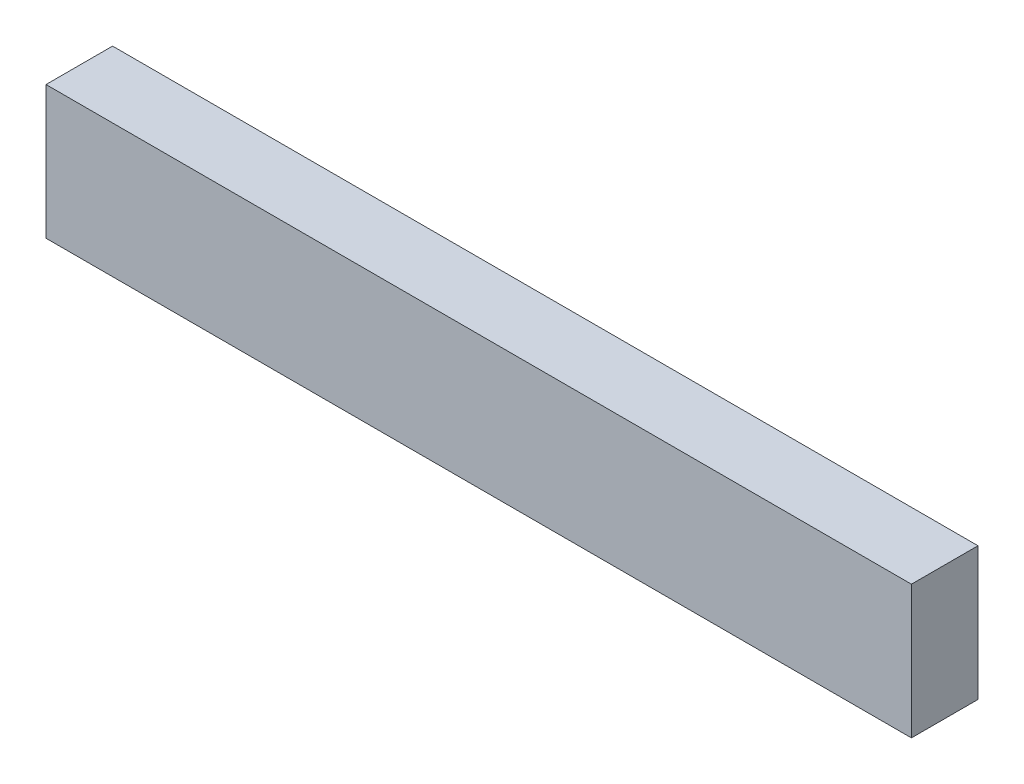
ISO-10303-21;
HEADER;
FILE_DESCRIPTION(('STEP AP214'),'2;1');
FILE_NAME('part.step','',(''),(''),'','','');
FILE_SCHEMA(('AUTOMOTIVE_DESIGN { 1 0 10303 214 1 1 1 1 }'));
ENDSEC;
DATA;
#1=APPLICATION_CONTEXT('core data for automotive mechanical design processes');
#2=APPLICATION_PROTOCOL_DEFINITION('international standard','automotive_design',2000,#1);
#3=PRODUCT_CONTEXT('',#1,'mechanical');
#4=PRODUCT('Part','Part','',(#3));
#5=PRODUCT_RELATED_PRODUCT_CATEGORY('part','',(#4));
#6=PRODUCT_DEFINITION_FORMATION('','',#4);
#7=PRODUCT_DEFINITION_CONTEXT('part definition',#1,'design');
#8=PRODUCT_DEFINITION('design','',#6,#7);
#9=PRODUCT_DEFINITION_SHAPE('','',#8);
#10=(LENGTH_UNIT() NAMED_UNIT(*) SI_UNIT(.MILLI.,.METRE.));
#11=(NAMED_UNIT(*) PLANE_ANGLE_UNIT() SI_UNIT($,.RADIAN.));
#12=(NAMED_UNIT(*) SI_UNIT($,.STERADIAN.) SOLID_ANGLE_UNIT());
#13=UNCERTAINTY_MEASURE_WITH_UNIT(LENGTH_MEASURE(1.E-05),#10,'distance_accuracy_value','');
#14=(GEOMETRIC_REPRESENTATION_CONTEXT(3) GLOBAL_UNCERTAINTY_ASSIGNED_CONTEXT((#13)) GLOBAL_UNIT_ASSIGNED_CONTEXT((#10,
#11,#12)) REPRESENTATION_CONTEXT('',''));
#15=CARTESIAN_POINT('',(0.,0.,0.));
#16=DIRECTION('',(0.,0.,1.));
#17=DIRECTION('',(1.,0.,0.));
#18=AXIS2_PLACEMENT_3D('',#15,#16,#17);
#19=CARTESIAN_POINT('',(82.55,12.7,-6.35));
#20=DIRECTION('',(0.,0.,1.));
#21=DIRECTION('',(0.,-1.,0.));
#22=AXIS2_PLACEMENT_3D('',#19,#20,#21);
#23=PLANE('',#22);
#24=DIRECTION('',(0.,1.,0.));
#25=VECTOR('',#24,1.);
#26=CARTESIAN_POINT('',(-82.55,12.7,-6.35));
#27=LINE('',#26,#25);
#28=CARTESIAN_POINT('',(-82.55,-12.7,-6.35));
#29=VERTEX_POINT('',#28);
#30=CARTESIAN_POINT('',(-82.55,12.7,-6.35));
#31=VERTEX_POINT('',#30);
#32=EDGE_CURVE('E107',#29,#31,#27,.T.);
#33=ORIENTED_EDGE('',*,*,#32,.T.);
#34=DIRECTION('',(-1.,0.,0.));
#35=VECTOR('',#34,1.);
#36=CARTESIAN_POINT('',(82.55,12.7,-6.35));
#37=LINE('',#36,#35);
#38=CARTESIAN_POINT('',(82.55,12.7,-6.35));
#39=VERTEX_POINT('',#38);
#40=EDGE_CURVE('E11',#39,#31,#37,.T.);
#41=ORIENTED_EDGE('',*,*,#40,.F.);
#42=DIRECTION('',(0.,1.,0.));
#43=VECTOR('',#42,1.);
#44=CARTESIAN_POINT('',(82.55,12.7,-6.35));
#45=LINE('',#44,#43);
#46=CARTESIAN_POINT('',(82.55,-12.7,-6.35));
#47=VERTEX_POINT('',#46);
#48=EDGE_CURVE('E91',#47,#39,#45,.T.);
#49=ORIENTED_EDGE('',*,*,#48,.F.);
#50=DIRECTION('',(-1.,0.,0.));
#51=VECTOR('',#50,1.);
#52=CARTESIAN_POINT('',(82.55,-12.7,-6.35));
#53=LINE('',#52,#51);
#54=EDGE_CURVE('E103',#47,#29,#53,.T.);
#55=ORIENTED_EDGE('',*,*,#54,.T.);
#56=EDGE_LOOP('',(#33,#41,#49,#55));
#57=FACE_BOUND('',#56,.T.);
#58=ADVANCED_FACE('F39',(#57),#23,.F.);
#59=CARTESIAN_POINT('',(82.55,12.7,6.35));
#60=DIRECTION('',(0.,-1.,0.));
#61=DIRECTION('',(0.,0.,-1.));
#62=AXIS2_PLACEMENT_3D('',#59,#60,#61);
#63=PLANE('',#62);
#64=DIRECTION('',(0.,0.,1.));
#65=VECTOR('',#64,1.);
#66=CARTESIAN_POINT('',(-82.55,12.7,6.35));
#67=LINE('',#66,#65);
#68=CARTESIAN_POINT('',(-82.55,12.7,6.35));
#69=VERTEX_POINT('',#68);
#70=EDGE_CURVE('E96',#31,#69,#67,.T.);
#71=ORIENTED_EDGE('',*,*,#70,.T.);
#72=DIRECTION('',(-1.,0.,0.));
#73=VECTOR('',#72,1.);
#74=CARTESIAN_POINT('',(82.55,12.7,6.35));
#75=LINE('',#74,#73);
#76=CARTESIAN_POINT('',(82.55,12.7,6.35));
#77=VERTEX_POINT('',#76);
#78=EDGE_CURVE('E48',#77,#69,#75,.T.);
#79=ORIENTED_EDGE('',*,*,#78,.F.);
#80=DIRECTION('',(0.,0.,1.));
#81=VECTOR('',#80,1.);
#82=CARTESIAN_POINT('',(82.55,12.7,6.35));
#83=LINE('',#82,#81);
#84=EDGE_CURVE('E86',#39,#77,#83,.T.);
#85=ORIENTED_EDGE('',*,*,#84,.F.);
#86=ORIENTED_EDGE('',*,*,#40,.T.);
#87=EDGE_LOOP('',(#71,#79,#85,#86));
#88=FACE_BOUND('',#87,.T.);
#89=ADVANCED_FACE('F95',(#88),#63,.F.);
#90=CARTESIAN_POINT('',(82.55,12.7,6.35));
#91=DIRECTION('',(0.,0.,-1.));
#92=DIRECTION('',(0.,1.,0.));
#93=AXIS2_PLACEMENT_3D('',#90,#91,#92);
#94=PLANE('',#93);
#95=DIRECTION('',(0.,-1.,0.));
#96=VECTOR('',#95,1.);
#97=CARTESIAN_POINT('',(-82.55,12.7,6.35));
#98=LINE('',#97,#96);
#99=CARTESIAN_POINT('',(-82.55,-12.7,6.35));
#100=VERTEX_POINT('',#99);
#101=EDGE_CURVE('E73',#69,#100,#98,.T.);
#102=ORIENTED_EDGE('',*,*,#101,.T.);
#103=DIRECTION('',(-1.,0.,0.));
#104=VECTOR('',#103,1.);
#105=CARTESIAN_POINT('',(82.55,-12.7,6.35));
#106=LINE('',#105,#104);
#107=CARTESIAN_POINT('',(82.55,-12.7,6.35));
#108=VERTEX_POINT('',#107);
#109=EDGE_CURVE('E98',#108,#100,#106,.T.);
#110=ORIENTED_EDGE('',*,*,#109,.F.);
#111=DIRECTION('',(0.,-1.,0.));
#112=VECTOR('',#111,1.);
#113=CARTESIAN_POINT('',(82.55,12.7,6.35));
#114=LINE('',#113,#112);
#115=EDGE_CURVE('E89',#77,#108,#114,.T.);
#116=ORIENTED_EDGE('',*,*,#115,.F.);
#117=ORIENTED_EDGE('',*,*,#78,.T.);
#118=EDGE_LOOP('',(#102,#110,#116,#117));
#119=FACE_BOUND('',#118,.T.);
#120=ADVANCED_FACE('F99',(#119),#94,.F.);
#121=CARTESIAN_POINT('',(82.55,-12.7,6.35));
#122=DIRECTION('',(0.,1.,0.));
#123=DIRECTION('',(0.,0.,1.));
#124=AXIS2_PLACEMENT_3D('',#121,#122,#123);
#125=PLANE('',#124);
#126=DIRECTION('',(0.,0.,-1.));
#127=VECTOR('',#126,1.);
#128=CARTESIAN_POINT('',(-82.55,-12.7,6.35));
#129=LINE('',#128,#127);
#130=EDGE_CURVE('E79',#100,#29,#129,.T.);
#131=ORIENTED_EDGE('',*,*,#130,.T.);
#132=ORIENTED_EDGE('',*,*,#54,.F.);
#133=DIRECTION('',(0.,0.,-1.));
#134=VECTOR('',#133,1.);
#135=CARTESIAN_POINT('',(82.55,-12.7,6.35));
#136=LINE('',#135,#134);
#137=EDGE_CURVE('E56',#108,#47,#136,.T.);
#138=ORIENTED_EDGE('',*,*,#137,.F.);
#139=ORIENTED_EDGE('',*,*,#109,.T.);
#140=EDGE_LOOP('',(#131,#132,#138,#139));
#141=FACE_BOUND('',#140,.T.);
#142=ADVANCED_FACE('F120',(#141),#125,.F.);
#143=CARTESIAN_POINT('',(82.55,0.,0.));
#144=DIRECTION('',(1.,0.,0.));
#145=DIRECTION('',(0.,0.,-1.));
#146=AXIS2_PLACEMENT_3D('',#143,#144,#145);
#147=PLANE('',#146);
#148=ORIENTED_EDGE('',*,*,#48,.T.);
#149=ORIENTED_EDGE('',*,*,#84,.T.);
#150=ORIENTED_EDGE('',*,*,#115,.T.);
#151=ORIENTED_EDGE('',*,*,#137,.T.);
#152=EDGE_LOOP('',(#148,#149,#150,#151));
#153=FACE_BOUND('',#152,.T.);
#154=ADVANCED_FACE('F87',(#153),#147,.T.);
#155=CARTESIAN_POINT('',(-82.55,0.,0.));
#156=DIRECTION('',(1.,0.,0.));
#157=DIRECTION('',(0.,0.,-1.));
#158=AXIS2_PLACEMENT_3D('',#155,#156,#157);
#159=PLANE('',#158);
#160=ORIENTED_EDGE('',*,*,#32,.F.);
#161=ORIENTED_EDGE('',*,*,#130,.F.);
#162=ORIENTED_EDGE('',*,*,#101,.F.);
#163=ORIENTED_EDGE('',*,*,#70,.F.);
#164=EDGE_LOOP('',(#160,#161,#162,#163));
#165=FACE_BOUND('',#164,.T.);
#166=ADVANCED_FACE('F123',(#165),#159,.F.);
#167=CLOSED_SHELL('',(#58,#89,#120,#142,#154,#166));
#168=MANIFOLD_SOLID_BREP('B2',#167);
#169=ADVANCED_BREP_SHAPE_REPRESENTATION('',(#18,#168),#14);
#170=SHAPE_DEFINITION_REPRESENTATION(#9,#169);
ENDSEC;
END-ISO-10303-21;
